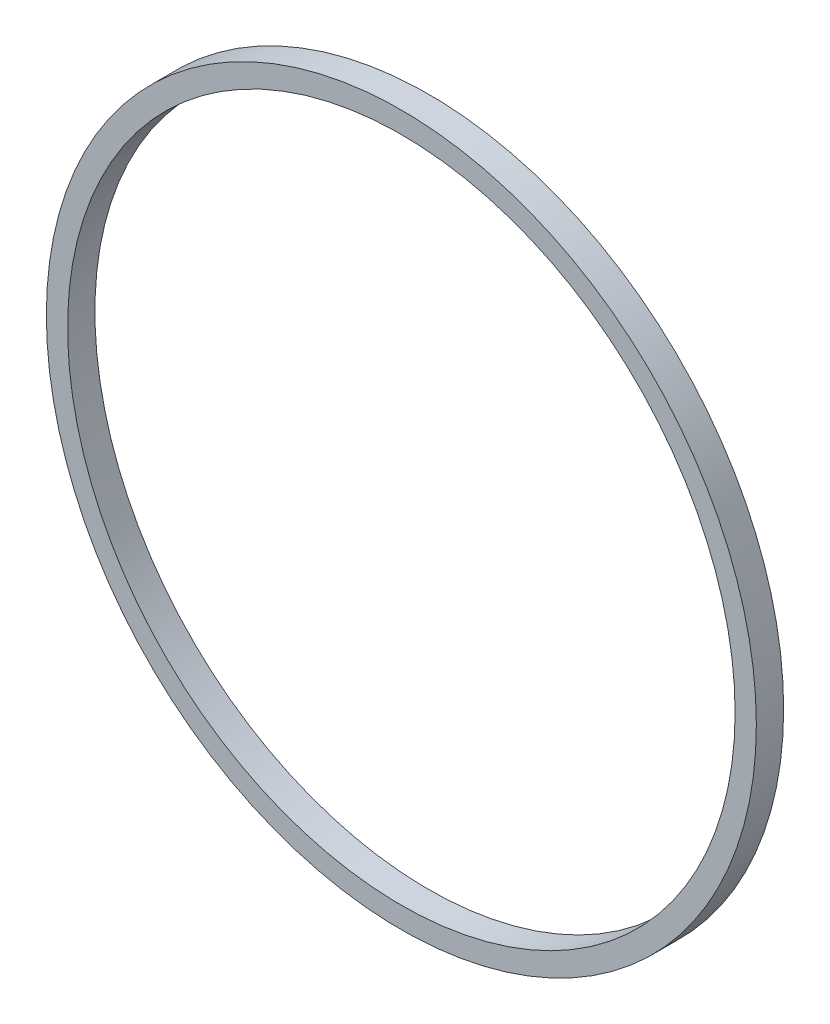
ISO-10303-21;
HEADER;
FILE_DESCRIPTION(('STEP AP214'),'2;1');
FILE_NAME('part.step','',(''),(''),'','','');
FILE_SCHEMA(('AUTOMOTIVE_DESIGN { 1 0 10303 214 1 1 1 1 }'));
ENDSEC;
DATA;
#1=APPLICATION_CONTEXT('core data for automotive mechanical design processes');
#2=APPLICATION_PROTOCOL_DEFINITION('international standard','automotive_design',2000,#1);
#3=PRODUCT_CONTEXT('',#1,'mechanical');
#4=PRODUCT('Part','Part','',(#3));
#5=PRODUCT_RELATED_PRODUCT_CATEGORY('part','',(#4));
#6=PRODUCT_DEFINITION_FORMATION('','',#4);
#7=PRODUCT_DEFINITION_CONTEXT('part definition',#1,'design');
#8=PRODUCT_DEFINITION('design','',#6,#7);
#9=PRODUCT_DEFINITION_SHAPE('','',#8);
#10=(LENGTH_UNIT() NAMED_UNIT(*) SI_UNIT(.MILLI.,.METRE.));
#11=(NAMED_UNIT(*) PLANE_ANGLE_UNIT() SI_UNIT($,.RADIAN.));
#12=(NAMED_UNIT(*) SI_UNIT($,.STERADIAN.) SOLID_ANGLE_UNIT());
#13=UNCERTAINTY_MEASURE_WITH_UNIT(LENGTH_MEASURE(1.E-05),#10,'distance_accuracy_value','');
#14=(GEOMETRIC_REPRESENTATION_CONTEXT(3) GLOBAL_UNCERTAINTY_ASSIGNED_CONTEXT((#13)) GLOBAL_UNIT_ASSIGNED_CONTEXT((#10,
#11,#12)) REPRESENTATION_CONTEXT('',''));
#15=CARTESIAN_POINT('',(0.,0.,0.));
#16=DIRECTION('',(0.,0.,1.));
#17=DIRECTION('',(1.,0.,0.));
#18=AXIS2_PLACEMENT_3D('',#15,#16,#17);
#19=CARTESIAN_POINT('',(70.1311792337737,84.2680326867237,4.5));
#20=DIRECTION('',(0.,0.,-1.));
#21=DIRECTION('',(-1.,0.,0.));
#22=AXIS2_PLACEMENT_3D('',#19,#20,#21);
#23=CYLINDRICAL_SURFACE('',#22,55.);
#24=CARTESIAN_POINT('',(70.1311792337737,84.2680326867237,4.5));
#25=DIRECTION('',(0.,0.,1.));
#26=DIRECTION('',(1.,0.,0.));
#27=AXIS2_PLACEMENT_3D('',#24,#25,#26);
#28=CIRCLE('',#27,55.);
#29=CARTESIAN_POINT('',(125.131179233774,84.2680326867237,4.5));
#30=VERTEX_POINT('',#29);
#31=EDGE_CURVE('E48',#30,#30,#28,.T.);
#32=ORIENTED_EDGE('',*,*,#31,.T.);
#33=EDGE_LOOP('',(#32));
#34=FACE_BOUND('',#33,.T.);
#35=CARTESIAN_POINT('',(70.1311792337737,84.2680326867237,0.));
#36=DIRECTION('',(0.,0.,1.));
#37=DIRECTION('',(1.,0.,0.));
#38=AXIS2_PLACEMENT_3D('',#35,#36,#37);
#39=CIRCLE('',#38,55.);
#40=CARTESIAN_POINT('',(125.131179233774,84.2680326867237,0.));
#41=VERTEX_POINT('',#40);
#42=EDGE_CURVE('E54',#41,#41,#39,.T.);
#43=ORIENTED_EDGE('',*,*,#42,.F.);
#44=EDGE_LOOP('',(#43));
#45=FACE_BOUND('',#44,.T.);
#46=ADVANCED_FACE('F41',(#34,#45),#23,.F.);
#47=CARTESIAN_POINT('',(70.1311792337737,84.2680326867237,4.5));
#48=DIRECTION('',(0.,0.,-1.));
#49=DIRECTION('',(-1.,0.,0.));
#50=AXIS2_PLACEMENT_3D('',#47,#48,#49);
#51=CYLINDRICAL_SURFACE('',#50,58.5);
#52=CARTESIAN_POINT('',(70.1311792337737,84.2680326867237,4.5));
#53=DIRECTION('',(0.,0.,1.));
#54=DIRECTION('',(1.,0.,0.));
#55=AXIS2_PLACEMENT_3D('',#52,#53,#54);
#56=CIRCLE('',#55,58.5);
#57=CARTESIAN_POINT('',(128.631179233774,84.2680326867237,4.5));
#58=VERTEX_POINT('',#57);
#59=EDGE_CURVE('E10',#58,#58,#56,.T.);
#60=ORIENTED_EDGE('',*,*,#59,.F.);
#61=EDGE_LOOP('',(#60));
#62=FACE_BOUND('',#61,.T.);
#63=CARTESIAN_POINT('',(70.1311792337737,84.2680326867237,0.));
#64=DIRECTION('',(0.,0.,1.));
#65=DIRECTION('',(1.,0.,0.));
#66=AXIS2_PLACEMENT_3D('',#63,#64,#65);
#67=CIRCLE('',#66,58.5);
#68=CARTESIAN_POINT('',(128.631179233774,84.2680326867237,0.));
#69=VERTEX_POINT('',#68);
#70=EDGE_CURVE('E44',#69,#69,#67,.T.);
#71=ORIENTED_EDGE('',*,*,#70,.T.);
#72=EDGE_LOOP('',(#71));
#73=FACE_BOUND('',#72,.T.);
#74=ADVANCED_FACE('F61',(#62,#73),#51,.T.);
#75=CARTESIAN_POINT('',(0.,0.,4.5));
#76=DIRECTION('',(0.,0.,1.));
#77=DIRECTION('',(1.,0.,0.));
#78=AXIS2_PLACEMENT_3D('',#75,#76,#77);
#79=PLANE('',#78);
#80=ORIENTED_EDGE('',*,*,#31,.F.);
#81=EDGE_LOOP('',(#80));
#82=FACE_BOUND('',#81,.T.);
#83=ORIENTED_EDGE('',*,*,#59,.T.);
#84=EDGE_LOOP('',(#83));
#85=FACE_BOUND('',#84,.T.);
#86=ADVANCED_FACE('F65',(#82,#85),#79,.T.);
#87=CARTESIAN_POINT('',(0.,0.,0.));
#88=DIRECTION('',(0.,0.,1.));
#89=DIRECTION('',(1.,0.,0.));
#90=AXIS2_PLACEMENT_3D('',#87,#88,#89);
#91=PLANE('',#90);
#92=ORIENTED_EDGE('',*,*,#42,.T.);
#93=EDGE_LOOP('',(#92));
#94=FACE_BOUND('',#93,.T.);
#95=ORIENTED_EDGE('',*,*,#70,.F.);
#96=EDGE_LOOP('',(#95));
#97=FACE_BOUND('',#96,.T.);
#98=ADVANCED_FACE('F63',(#94,#97),#91,.F.);
#99=CLOSED_SHELL('',(#46,#74,#86,#98));
#100=MANIFOLD_SOLID_BREP('B2',#99);
#101=ADVANCED_BREP_SHAPE_REPRESENTATION('',(#18,#100),#14);
#102=SHAPE_DEFINITION_REPRESENTATION(#9,#101);
ENDSEC;
END-ISO-10303-21;
